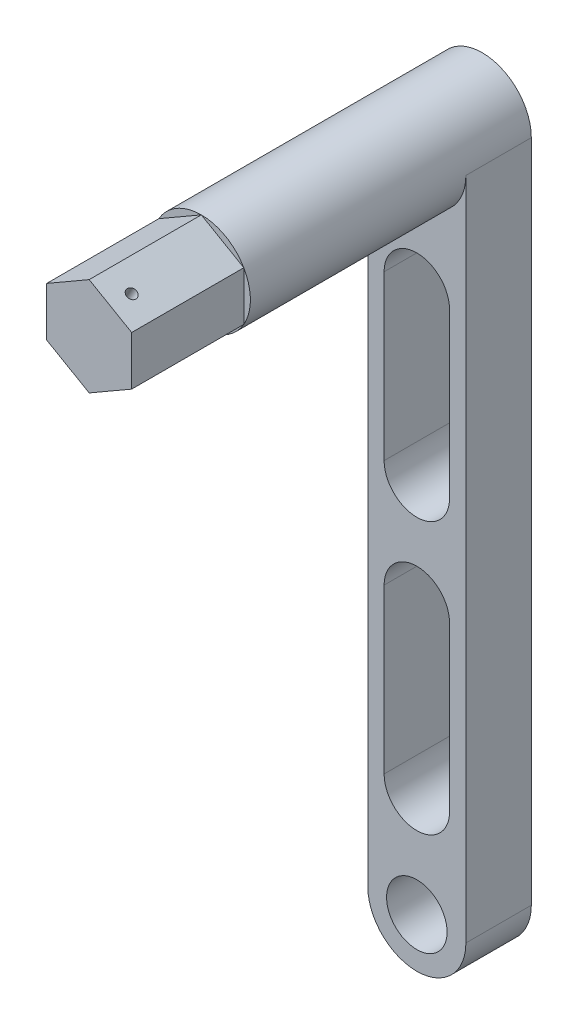
ISO-10303-21;
HEADER;
FILE_DESCRIPTION(('STEP AP214'),'2;1');
FILE_NAME('part.step','',(''),(''),'','','');
FILE_SCHEMA(('AUTOMOTIVE_DESIGN { 1 0 10303 214 1 1 1 1 }'));
ENDSEC;
DATA;
#1=APPLICATION_CONTEXT('core data for automotive mechanical design processes');
#2=APPLICATION_PROTOCOL_DEFINITION('international standard','automotive_design',2000,#1);
#3=PRODUCT_CONTEXT('',#1,'mechanical');
#4=PRODUCT('Part','Part','',(#3));
#5=PRODUCT_RELATED_PRODUCT_CATEGORY('part','',(#4));
#6=PRODUCT_DEFINITION_FORMATION('','',#4);
#7=PRODUCT_DEFINITION_CONTEXT('part definition',#1,'design');
#8=PRODUCT_DEFINITION('design','',#6,#7);
#9=PRODUCT_DEFINITION_SHAPE('','',#8);
#10=(LENGTH_UNIT() NAMED_UNIT(*) SI_UNIT(.MILLI.,.METRE.));
#11=(NAMED_UNIT(*) PLANE_ANGLE_UNIT() SI_UNIT($,.RADIAN.));
#12=(NAMED_UNIT(*) SI_UNIT($,.STERADIAN.) SOLID_ANGLE_UNIT());
#13=UNCERTAINTY_MEASURE_WITH_UNIT(LENGTH_MEASURE(1.E-05),#10,'distance_accuracy_value','');
#14=(GEOMETRIC_REPRESENTATION_CONTEXT(3) GLOBAL_UNCERTAINTY_ASSIGNED_CONTEXT((#13)) GLOBAL_UNIT_ASSIGNED_CONTEXT((#10,
#11,#12)) REPRESENTATION_CONTEXT('',''));
#15=CARTESIAN_POINT('',(0.,0.,0.));
#16=DIRECTION('',(0.,0.,1.));
#17=DIRECTION('',(1.,0.,0.));
#18=AXIS2_PLACEMENT_3D('',#15,#16,#17);
#19=CARTESIAN_POINT('',(0.,0.,42.94));
#20=DIRECTION('',(0.,0.,1.));
#21=DIRECTION('',(1.,0.,0.));
#22=AXIS2_PLACEMENT_3D('',#19,#20,#21);
#23=PLANE('',#22);
#24=DIRECTION('',(0.866025403784441,-0.499999999999995,0.));
#25=VECTOR('',#24,1.);
#26=CARTESIAN_POINT('',(-6.49519052838325,47.0499999999999,42.94));
#27=LINE('',#26,#25);
#28=CARTESIAN_POINT('',(-6.49519052838325,47.0499999999999,42.94));
#29=VERTEX_POINT('',#28);
#30=CARTESIAN_POINT('',(0.,43.3,42.94));
#31=VERTEX_POINT('',#30);
#32=EDGE_CURVE('E64',#29,#31,#27,.T.);
#33=ORIENTED_EDGE('',*,*,#32,.F.);
#34=CARTESIAN_POINT('',(0.,50.8,42.94));
#35=DIRECTION('',(0.,0.,1.));
#36=DIRECTION('',(1.,0.,0.));
#37=AXIS2_PLACEMENT_3D('',#34,#35,#36);
#38=CIRCLE('',#37,7.5);
#39=EDGE_CURVE('E486',#29,#31,#38,.T.);
#40=ORIENTED_EDGE('',*,*,#39,.T.);
#41=EDGE_LOOP('',(#33,#40));
#42=FACE_BOUND('',#41,.T.);
#43=ADVANCED_FACE('F40',(#42),#23,.T.);
#44=DIRECTION('',(0.,-1.,0.));
#45=VECTOR('',#44,1.);
#46=CARTESIAN_POINT('',(-6.49519052838333,54.5499999999999,42.94));
#47=LINE('',#46,#45);
#48=CARTESIAN_POINT('',(-6.49519052838333,54.5499999999999,42.94));
#49=VERTEX_POINT('',#48);
#50=EDGE_CURVE('E189',#49,#29,#47,.T.);
#51=ORIENTED_EDGE('',*,*,#50,.F.);
#52=EDGE_CURVE('E485',#49,#29,#38,.T.);
#53=ORIENTED_EDGE('',*,*,#52,.T.);
#54=EDGE_LOOP('',(#51,#53));
#55=FACE_BOUND('',#54,.T.);
#56=ADVANCED_FACE('F372',(#55),#23,.T.);
#57=DIRECTION('',(-0.866025403784435,-0.500000000000007,0.));
#58=VECTOR('',#57,1.);
#59=CARTESIAN_POINT('',(0.,58.3,42.94));
#60=LINE('',#59,#58);
#61=CARTESIAN_POINT('',(0.,58.3,42.94));
#62=VERTEX_POINT('',#61);
#63=EDGE_CURVE('E440',#62,#49,#60,.T.);
#64=ORIENTED_EDGE('',*,*,#63,.F.);
#65=EDGE_CURVE('E207',#62,#49,#38,.T.);
#66=ORIENTED_EDGE('',*,*,#65,.T.);
#67=EDGE_LOOP('',(#64,#66));
#68=FACE_BOUND('',#67,.T.);
#69=ADVANCED_FACE('F376',(#68),#23,.T.);
#70=DIRECTION('',(-0.866025403784442,0.499999999999995,0.));
#71=VECTOR('',#70,1.);
#72=CARTESIAN_POINT('',(6.49519052838327,54.55,42.94));
#73=LINE('',#72,#71);
#74=CARTESIAN_POINT('',(6.49519052838327,54.55,42.94));
#75=VERTEX_POINT('',#74);
#76=EDGE_CURVE('E436',#75,#62,#73,.T.);
#77=ORIENTED_EDGE('',*,*,#76,.F.);
#78=EDGE_CURVE('E203',#75,#62,#38,.T.);
#79=ORIENTED_EDGE('',*,*,#78,.T.);
#80=EDGE_LOOP('',(#77,#79));
#81=FACE_BOUND('',#80,.T.);
#82=ADVANCED_FACE('F472',(#81),#23,.T.);
#83=DIRECTION('',(0.,1.,0.));
#84=VECTOR('',#83,1.);
#85=CARTESIAN_POINT('',(6.4951905283833,47.05,42.94));
#86=LINE('',#85,#84);
#87=CARTESIAN_POINT('',(6.4951905283833,47.05,42.94));
#88=VERTEX_POINT('',#87);
#89=EDGE_CURVE('E432',#88,#75,#86,.T.);
#90=ORIENTED_EDGE('',*,*,#89,.F.);
#91=EDGE_CURVE('E197',#88,#75,#38,.T.);
#92=ORIENTED_EDGE('',*,*,#91,.T.);
#93=EDGE_LOOP('',(#90,#92));
#94=FACE_BOUND('',#93,.T.);
#95=ADVANCED_FACE('F367',(#94),#23,.T.);
#96=CARTESIAN_POINT('',(0.,-9.675,10.));
#97=DIRECTION('',(0.,0.,-1.));
#98=DIRECTION('',(-1.,0.,0.));
#99=AXIS2_PLACEMENT_3D('',#96,#97,#98);
#100=CYLINDRICAL_SURFACE('',#99,5.);
#101=CARTESIAN_POINT('',(0.,-9.675,0.));
#102=DIRECTION('',(0.,0.,1.));
#103=DIRECTION('',(1.,0.,0.));
#104=AXIS2_PLACEMENT_3D('',#101,#102,#103);
#105=CIRCLE('',#104,5.);
#106=CARTESIAN_POINT('',(5.,-9.67499999999998,0.));
#107=VERTEX_POINT('',#106);
#108=CARTESIAN_POINT('',(-5.00000000000001,-9.67499999999998,0.));
#109=VERTEX_POINT('',#108);
#110=EDGE_CURVE('E285',#107,#109,#105,.T.);
#111=ORIENTED_EDGE('',*,*,#110,.F.);
#112=DIRECTION('',(0.,0.,-1.));
#113=VECTOR('',#112,1.);
#114=CARTESIAN_POINT('',(5.,-9.67499999999998,10.));
#115=LINE('',#114,#113);
#116=CARTESIAN_POINT('',(5.,-9.67499999999998,10.));
#117=VERTEX_POINT('',#116);
#118=EDGE_CURVE('E11',#117,#107,#115,.T.);
#119=ORIENTED_EDGE('',*,*,#118,.F.);
#120=CARTESIAN_POINT('',(0.,-9.675,10.));
#121=DIRECTION('',(0.,0.,1.));
#122=DIRECTION('',(1.,0.,0.));
#123=AXIS2_PLACEMENT_3D('',#120,#121,#122);
#124=CIRCLE('',#123,5.);
#125=CARTESIAN_POINT('',(-5.00000000000001,-9.67499999999998,10.));
#126=VERTEX_POINT('',#125);
#127=EDGE_CURVE('E239',#117,#126,#124,.T.);
#128=ORIENTED_EDGE('',*,*,#127,.T.);
#129=DIRECTION('',(0.,0.,-1.));
#130=VECTOR('',#129,1.);
#131=CARTESIAN_POINT('',(-5.00000000000001,-9.67499999999998,10.));
#132=LINE('',#131,#130);
#133=EDGE_CURVE('E304',#126,#109,#132,.T.);
#134=ORIENTED_EDGE('',*,*,#133,.T.);
#135=EDGE_LOOP('',(#111,#119,#128,#134));
#136=FACE_BOUND('',#135,.T.);
#137=ADVANCED_FACE('F478',(#136),#100,.F.);
#138=CARTESIAN_POINT('',(5.,0.,10.));
#139=DIRECTION('',(-1.,0.,0.));
#140=DIRECTION('',(0.,-1.,0.));
#141=AXIS2_PLACEMENT_3D('',#138,#139,#140);
#142=PLANE('',#141);
#143=DIRECTION('',(0.,1.,0.));
#144=VECTOR('',#143,1.);
#145=CARTESIAN_POINT('',(5.,0.,0.));
#146=LINE('',#145,#144);
#147=CARTESIAN_POINT('',(5.,-34.675,0.));
#148=VERTEX_POINT('',#147);
#149=EDGE_CURVE('E289',#148,#107,#146,.T.);
#150=ORIENTED_EDGE('',*,*,#149,.F.);
#151=DIRECTION('',(0.,0.,-1.));
#152=VECTOR('',#151,1.);
#153=CARTESIAN_POINT('',(5.,-34.675,10.));
#154=LINE('',#153,#152);
#155=CARTESIAN_POINT('',(5.,-34.675,10.));
#156=VERTEX_POINT('',#155);
#157=EDGE_CURVE('E50',#156,#148,#154,.T.);
#158=ORIENTED_EDGE('',*,*,#157,.F.);
#159=DIRECTION('',(0.,1.,0.));
#160=VECTOR('',#159,1.);
#161=CARTESIAN_POINT('',(5.,0.,10.));
#162=LINE('',#161,#160);
#163=EDGE_CURVE('E243',#156,#117,#162,.T.);
#164=ORIENTED_EDGE('',*,*,#163,.T.);
#165=ORIENTED_EDGE('',*,*,#118,.T.);
#166=EDGE_LOOP('',(#150,#158,#164,#165));
#167=FACE_BOUND('',#166,.T.);
#168=ADVANCED_FACE('F607',(#167),#142,.T.);
#169=CARTESIAN_POINT('',(0.,-34.675,10.));
#170=DIRECTION('',(0.,0.,-1.));
#171=DIRECTION('',(-1.,0.,0.));
#172=AXIS2_PLACEMENT_3D('',#169,#170,#171);
#173=CYLINDRICAL_SURFACE('',#172,5.);
#174=CARTESIAN_POINT('',(0.,-34.675,0.));
#175=DIRECTION('',(0.,0.,1.));
#176=DIRECTION('',(1.,0.,0.));
#177=AXIS2_PLACEMENT_3D('',#174,#175,#176);
#178=CIRCLE('',#177,5.);
#179=CARTESIAN_POINT('',(-5.,-34.675,0.));
#180=VERTEX_POINT('',#179);
#181=EDGE_CURVE('E293',#180,#148,#178,.T.);
#182=ORIENTED_EDGE('',*,*,#181,.F.);
#183=DIRECTION('',(0.,0.,-1.));
#184=VECTOR('',#183,1.);
#185=CARTESIAN_POINT('',(-5.,-34.675,10.));
#186=LINE('',#185,#184);
#187=CARTESIAN_POINT('',(-5.,-34.675,10.));
#188=VERTEX_POINT('',#187);
#189=EDGE_CURVE('E307',#188,#180,#186,.T.);
#190=ORIENTED_EDGE('',*,*,#189,.F.);
#191=CARTESIAN_POINT('',(0.,-34.675,10.));
#192=DIRECTION('',(0.,0.,1.));
#193=DIRECTION('',(1.,0.,0.));
#194=AXIS2_PLACEMENT_3D('',#191,#192,#193);
#195=CIRCLE('',#194,5.);
#196=EDGE_CURVE('E247',#188,#156,#195,.T.);
#197=ORIENTED_EDGE('',*,*,#196,.T.);
#198=ORIENTED_EDGE('',*,*,#157,.T.);
#199=EDGE_LOOP('',(#182,#190,#197,#198));
#200=FACE_BOUND('',#199,.T.);
#201=ADVANCED_FACE('F597',(#200),#173,.F.);
#202=CARTESIAN_POINT('',(0.,6.80000000000001,10.));
#203=DIRECTION('',(0.,0.,-1.));
#204=DIRECTION('',(-1.,0.,0.));
#205=AXIS2_PLACEMENT_3D('',#202,#203,#204);
#206=CYLINDRICAL_SURFACE('',#205,5.);
#207=CARTESIAN_POINT('',(0.,6.80000000000001,0.));
#208=DIRECTION('',(0.,0.,1.));
#209=DIRECTION('',(1.,0.,0.));
#210=AXIS2_PLACEMENT_3D('',#207,#208,#209);
#211=CIRCLE('',#210,5.);
#212=CARTESIAN_POINT('',(-5.,6.80000000000001,0.));
#213=VERTEX_POINT('',#212);
#214=CARTESIAN_POINT('',(5.,6.80000000000002,0.));
#215=VERTEX_POINT('',#214);
#216=EDGE_CURVE('E269',#213,#215,#211,.T.);
#217=ORIENTED_EDGE('',*,*,#216,.F.);
#218=DIRECTION('',(0.,0.,-1.));
#219=VECTOR('',#218,1.);
#220=CARTESIAN_POINT('',(-5.,6.80000000000001,10.));
#221=LINE('',#220,#219);
#222=CARTESIAN_POINT('',(-5.,6.80000000000001,10.));
#223=VERTEX_POINT('',#222);
#224=EDGE_CURVE('E308',#223,#213,#221,.T.);
#225=ORIENTED_EDGE('',*,*,#224,.F.);
#226=CARTESIAN_POINT('',(0.,6.80000000000001,10.));
#227=DIRECTION('',(0.,0.,1.));
#228=DIRECTION('',(1.,0.,0.));
#229=AXIS2_PLACEMENT_3D('',#226,#227,#228);
#230=CIRCLE('',#229,5.);
#231=CARTESIAN_POINT('',(5.,6.80000000000002,10.));
#232=VERTEX_POINT('',#231);
#233=EDGE_CURVE('E224',#223,#232,#230,.T.);
#234=ORIENTED_EDGE('',*,*,#233,.T.);
#235=DIRECTION('',(0.,0.,-1.));
#236=VECTOR('',#235,1.);
#237=CARTESIAN_POINT('',(5.,6.80000000000002,10.));
#238=LINE('',#237,#236);
#239=EDGE_CURVE('E313',#232,#215,#238,.T.);
#240=ORIENTED_EDGE('',*,*,#239,.T.);
#241=EDGE_LOOP('',(#217,#225,#234,#240));
#242=FACE_BOUND('',#241,.T.);
#243=ADVANCED_FACE('F587',(#242),#206,.F.);
#244=CARTESIAN_POINT('',(-5.,0.,10.));
#245=DIRECTION('',(1.,0.,0.));
#246=DIRECTION('',(0.,0.,-1.));
#247=AXIS2_PLACEMENT_3D('',#244,#245,#246);
#248=PLANE('',#247);
#249=DIRECTION('',(0.,-1.,0.));
#250=VECTOR('',#249,1.);
#251=CARTESIAN_POINT('',(-5.,0.,0.));
#252=LINE('',#251,#250);
#253=CARTESIAN_POINT('',(-5.,31.8,0.));
#254=VERTEX_POINT('',#253);
#255=EDGE_CURVE('E273',#254,#213,#252,.T.);
#256=ORIENTED_EDGE('',*,*,#255,.F.);
#257=DIRECTION('',(0.,0.,-1.));
#258=VECTOR('',#257,1.);
#259=CARTESIAN_POINT('',(-5.,31.8,10.));
#260=LINE('',#259,#258);
#261=CARTESIAN_POINT('',(-5.,31.8,10.));
#262=VERTEX_POINT('',#261);
#263=EDGE_CURVE('E320',#262,#254,#260,.T.);
#264=ORIENTED_EDGE('',*,*,#263,.F.);
#265=DIRECTION('',(0.,-1.,0.));
#266=VECTOR('',#265,1.);
#267=CARTESIAN_POINT('',(-5.,0.,10.));
#268=LINE('',#267,#266);
#269=EDGE_CURVE('E228',#262,#223,#268,.T.);
#270=ORIENTED_EDGE('',*,*,#269,.T.);
#271=ORIENTED_EDGE('',*,*,#224,.T.);
#272=EDGE_LOOP('',(#256,#264,#270,#271));
#273=FACE_BOUND('',#272,.T.);
#274=ADVANCED_FACE('F577',(#273),#248,.T.);
#275=CARTESIAN_POINT('',(0.,31.8,10.));
#276=DIRECTION('',(0.,0.,-1.));
#277=DIRECTION('',(-1.,0.,0.));
#278=AXIS2_PLACEMENT_3D('',#275,#276,#277);
#279=CYLINDRICAL_SURFACE('',#278,5.);
#280=CARTESIAN_POINT('',(0.,31.8,0.));
#281=DIRECTION('',(0.,0.,1.));
#282=DIRECTION('',(1.,0.,0.));
#283=AXIS2_PLACEMENT_3D('',#280,#281,#282);
#284=CIRCLE('',#283,5.);
#285=CARTESIAN_POINT('',(5.,31.8,0.));
#286=VERTEX_POINT('',#285);
#287=EDGE_CURVE('E277',#286,#254,#284,.T.);
#288=ORIENTED_EDGE('',*,*,#287,.F.);
#289=DIRECTION('',(0.,0.,-1.));
#290=VECTOR('',#289,1.);
#291=CARTESIAN_POINT('',(5.,31.8,10.));
#292=LINE('',#291,#290);
#293=CARTESIAN_POINT('',(5.,31.8,10.));
#294=VERTEX_POINT('',#293);
#295=EDGE_CURVE('E316',#294,#286,#292,.T.);
#296=ORIENTED_EDGE('',*,*,#295,.F.);
#297=CARTESIAN_POINT('',(0.,31.8,10.));
#298=DIRECTION('',(0.,0.,1.));
#299=DIRECTION('',(1.,0.,0.));
#300=AXIS2_PLACEMENT_3D('',#297,#298,#299);
#301=CIRCLE('',#300,5.);
#302=EDGE_CURVE('E232',#294,#262,#301,.T.);
#303=ORIENTED_EDGE('',*,*,#302,.T.);
#304=ORIENTED_EDGE('',*,*,#263,.T.);
#305=EDGE_LOOP('',(#288,#296,#303,#304));
#306=FACE_BOUND('',#305,.T.);
#307=ADVANCED_FACE('F538',(#306),#279,.F.);
#308=CARTESIAN_POINT('',(-7.50000000000001,0.,10.));
#309=DIRECTION('',(-1.,0.,0.));
#310=DIRECTION('',(0.,-1.,0.));
#311=AXIS2_PLACEMENT_3D('',#308,#309,#310);
#312=PLANE('',#311);
#313=DIRECTION('',(0.,1.,0.));
#314=VECTOR('',#313,1.);
#315=CARTESIAN_POINT('',(-7.50000000000001,0.,0.));
#316=LINE('',#315,#314);
#317=CARTESIAN_POINT('',(-7.5,-50.8,0.));
#318=VERTEX_POINT('',#317);
#319=CARTESIAN_POINT('',(-7.5,50.8,0.));
#320=VERTEX_POINT('',#319);
#321=EDGE_CURVE('E206',#318,#320,#316,.T.);
#322=ORIENTED_EDGE('',*,*,#321,.F.);
#323=DIRECTION('',(0.,0.,-1.));
#324=VECTOR('',#323,1.);
#325=CARTESIAN_POINT('',(-7.5,-50.8,10.));
#326=LINE('',#325,#324);
#327=CARTESIAN_POINT('',(-7.5,-50.8,10.));
#328=VERTEX_POINT('',#327);
#329=EDGE_CURVE('E332',#328,#318,#326,.T.);
#330=ORIENTED_EDGE('',*,*,#329,.F.);
#331=DIRECTION('',(0.,1.,0.));
#332=VECTOR('',#331,1.);
#333=CARTESIAN_POINT('',(-7.50000000000001,0.,10.));
#334=LINE('',#333,#332);
#335=CARTESIAN_POINT('',(-7.5,50.8,10.));
#336=VERTEX_POINT('',#335);
#337=EDGE_CURVE('E212',#328,#336,#334,.T.);
#338=ORIENTED_EDGE('',*,*,#337,.T.);
#339=DIRECTION('',(0.,0.,-1.));
#340=VECTOR('',#339,1.);
#341=CARTESIAN_POINT('',(-7.50000000000002,50.8,10.));
#342=LINE('',#341,#340);
#343=EDGE_CURVE('E317',#336,#320,#342,.T.);
#344=ORIENTED_EDGE('',*,*,#343,.T.);
#345=EDGE_LOOP('',(#322,#330,#338,#344));
#346=FACE_BOUND('',#345,.T.);
#347=ADVANCED_FACE('F42',(#346),#312,.T.);
#348=CARTESIAN_POINT('',(0.,-50.8,10.));
#349=DIRECTION('',(0.,0.,-1.));
#350=DIRECTION('',(-1.,0.,0.));
#351=AXIS2_PLACEMENT_3D('',#348,#349,#350);
#352=CYLINDRICAL_SURFACE('',#351,7.5);
#353=CARTESIAN_POINT('',(0.,-50.8,0.));
#354=DIRECTION('',(0.,0.,1.));
#355=DIRECTION('',(1.,0.,0.));
#356=AXIS2_PLACEMENT_3D('',#353,#354,#355);
#357=CIRCLE('',#356,7.5);
#358=CARTESIAN_POINT('',(7.5,-50.8,0.));
#359=VERTEX_POINT('',#358);
#360=EDGE_CURVE('E262',#318,#359,#357,.T.);
#361=ORIENTED_EDGE('',*,*,#360,.T.);
#362=DIRECTION('',(0.,0.,-1.));
#363=VECTOR('',#362,1.);
#364=CARTESIAN_POINT('',(7.5,-50.8,10.));
#365=LINE('',#364,#363);
#366=CARTESIAN_POINT('',(7.5,-50.8,10.));
#367=VERTEX_POINT('',#366);
#368=EDGE_CURVE('E328',#367,#359,#365,.T.);
#369=ORIENTED_EDGE('',*,*,#368,.F.);
#370=CARTESIAN_POINT('',(0.,-50.8,10.));
#371=DIRECTION('',(0.,0.,1.));
#372=DIRECTION('',(1.,0.,0.));
#373=AXIS2_PLACEMENT_3D('',#370,#371,#372);
#374=CIRCLE('',#373,7.5);
#375=EDGE_CURVE('E217',#328,#367,#374,.T.);
#376=ORIENTED_EDGE('',*,*,#375,.F.);
#377=ORIENTED_EDGE('',*,*,#329,.T.);
#378=EDGE_LOOP('',(#361,#369,#376,#377));
#379=FACE_BOUND('',#378,.T.);
#380=ADVANCED_FACE('F348',(#379),#352,.T.);
#381=CARTESIAN_POINT('',(-5.00000000000001,0.,10.));
#382=DIRECTION('',(-1.,0.,0.));
#383=DIRECTION('',(0.,-1.,0.));
#384=AXIS2_PLACEMENT_3D('',#381,#382,#383);
#385=PLANE('',#384);
#386=DIRECTION('',(0.,1.,0.));
#387=VECTOR('',#386,1.);
#388=CARTESIAN_POINT('',(-5.00000000000001,0.,0.));
#389=LINE('',#388,#387);
#390=EDGE_CURVE('E297',#180,#109,#389,.T.);
#391=ORIENTED_EDGE('',*,*,#390,.T.);
#392=ORIENTED_EDGE('',*,*,#133,.F.);
#393=DIRECTION('',(0.,1.,0.));
#394=VECTOR('',#393,1.);
#395=CARTESIAN_POINT('',(-5.00000000000001,0.,10.));
#396=LINE('',#395,#394);
#397=EDGE_CURVE('E251',#188,#126,#396,.T.);
#398=ORIENTED_EDGE('',*,*,#397,.F.);
#399=ORIENTED_EDGE('',*,*,#189,.T.);
#400=EDGE_LOOP('',(#391,#392,#398,#399));
#401=FACE_BOUND('',#400,.T.);
#402=ADVANCED_FACE('F555',(#401),#385,.F.);
#403=CARTESIAN_POINT('',(5.,0.,10.));
#404=DIRECTION('',(1.,0.,0.));
#405=DIRECTION('',(0.,0.,-1.));
#406=AXIS2_PLACEMENT_3D('',#403,#404,#405);
#407=PLANE('',#406);
#408=DIRECTION('',(0.,-1.,0.));
#409=VECTOR('',#408,1.);
#410=CARTESIAN_POINT('',(5.,0.,0.));
#411=LINE('',#410,#409);
#412=EDGE_CURVE('E281',#286,#215,#411,.T.);
#413=ORIENTED_EDGE('',*,*,#412,.T.);
#414=ORIENTED_EDGE('',*,*,#239,.F.);
#415=DIRECTION('',(0.,-1.,0.));
#416=VECTOR('',#415,1.);
#417=CARTESIAN_POINT('',(5.,0.,10.));
#418=LINE('',#417,#416);
#419=EDGE_CURVE('E236',#294,#232,#418,.T.);
#420=ORIENTED_EDGE('',*,*,#419,.F.);
#421=ORIENTED_EDGE('',*,*,#295,.T.);
#422=EDGE_LOOP('',(#413,#414,#420,#421));
#423=FACE_BOUND('',#422,.T.);
#424=ADVANCED_FACE('F527',(#423),#407,.F.);
#425=CARTESIAN_POINT('',(7.49999999999999,0.,10.));
#426=DIRECTION('',(-1.,0.,0.));
#427=DIRECTION('',(0.,-1.,0.));
#428=AXIS2_PLACEMENT_3D('',#425,#426,#427);
#429=PLANE('',#428);
#430=DIRECTION('',(0.,1.,0.));
#431=VECTOR('',#430,1.);
#432=CARTESIAN_POINT('',(7.49999999999999,0.,0.));
#433=LINE('',#432,#431);
#434=CARTESIAN_POINT('',(7.49999999999998,50.8,0.));
#435=VERTEX_POINT('',#434);
#436=EDGE_CURVE('E265',#359,#435,#433,.T.);
#437=ORIENTED_EDGE('',*,*,#436,.T.);
#438=DIRECTION('',(0.,0.,-1.));
#439=VECTOR('',#438,1.);
#440=CARTESIAN_POINT('',(7.49999999999998,50.8,10.));
#441=LINE('',#440,#439);
#442=CARTESIAN_POINT('',(7.5,50.8,10.));
#443=VERTEX_POINT('',#442);
#444=EDGE_CURVE('E258',#443,#435,#441,.T.);
#445=ORIENTED_EDGE('',*,*,#444,.F.);
#446=DIRECTION('',(0.,1.,0.));
#447=VECTOR('',#446,1.);
#448=CARTESIAN_POINT('',(7.49999999999999,0.,10.));
#449=LINE('',#448,#447);
#450=EDGE_CURVE('E220',#367,#443,#449,.T.);
#451=ORIENTED_EDGE('',*,*,#450,.F.);
#452=ORIENTED_EDGE('',*,*,#368,.T.);
#453=EDGE_LOOP('',(#437,#445,#451,#452));
#454=FACE_BOUND('',#453,.T.);
#455=ADVANCED_FACE('F352',(#454),#429,.F.);
#456=CARTESIAN_POINT('',(0.,-50.8,10.));
#457=DIRECTION('',(0.,0.,-1.));
#458=DIRECTION('',(-1.,0.,0.));
#459=AXIS2_PLACEMENT_3D('',#456,#457,#458);
#460=CYLINDRICAL_SURFACE('',#459,4.625);
#461=CARTESIAN_POINT('',(0.,-50.8,10.));
#462=DIRECTION('',(0.,0.,1.));
#463=DIRECTION('',(1.,0.,0.));
#464=AXIS2_PLACEMENT_3D('',#461,#462,#463);
#465=CIRCLE('',#464,4.625);
#466=CARTESIAN_POINT('',(4.62500000000001,-50.8,10.));
#467=VERTEX_POINT('',#466);
#468=EDGE_CURVE('E254',#467,#467,#465,.T.);
#469=ORIENTED_EDGE('',*,*,#468,.T.);
#470=EDGE_LOOP('',(#469));
#471=FACE_BOUND('',#470,.T.);
#472=CARTESIAN_POINT('',(0.,-50.8,0.));
#473=DIRECTION('',(0.,0.,1.));
#474=DIRECTION('',(1.,0.,0.));
#475=AXIS2_PLACEMENT_3D('',#472,#473,#474);
#476=CIRCLE('',#475,4.625);
#477=CARTESIAN_POINT('',(4.62500000000001,-50.8,0.));
#478=VERTEX_POINT('',#477);
#479=EDGE_CURVE('E213',#478,#478,#476,.T.);
#480=ORIENTED_EDGE('',*,*,#479,.F.);
#481=EDGE_LOOP('',(#480));
#482=FACE_BOUND('',#481,.T.);
#483=ADVANCED_FACE('F517',(#471,#482),#460,.F.);
#484=CARTESIAN_POINT('',(0.,0.,10.));
#485=DIRECTION('',(0.,0.,1.));
#486=DIRECTION('',(1.,0.,0.));
#487=AXIS2_PLACEMENT_3D('',#484,#485,#486);
#488=PLANE('',#487);
#489=CARTESIAN_POINT('',(0.,50.8,10.));
#490=DIRECTION('',(0.,0.,1.));
#491=DIRECTION('',(1.,0.,0.));
#492=AXIS2_PLACEMENT_3D('',#489,#490,#491);
#493=CIRCLE('',#492,7.49999999999998);
#494=EDGE_CURVE('E209',#336,#443,#493,.T.);
#495=ORIENTED_EDGE('',*,*,#494,.F.);
#496=ORIENTED_EDGE('',*,*,#337,.F.);
#497=ORIENTED_EDGE('',*,*,#375,.T.);
#498=ORIENTED_EDGE('',*,*,#450,.T.);
#499=EDGE_LOOP('',(#495,#496,#497,#498));
#500=FACE_BOUND('',#499,.T.);
#501=ORIENTED_EDGE('',*,*,#233,.F.);
#502=ORIENTED_EDGE('',*,*,#269,.F.);
#503=ORIENTED_EDGE('',*,*,#302,.F.);
#504=ORIENTED_EDGE('',*,*,#419,.T.);
#505=EDGE_LOOP('',(#501,#502,#503,#504));
#506=FACE_BOUND('',#505,.T.);
#507=ORIENTED_EDGE('',*,*,#127,.F.);
#508=ORIENTED_EDGE('',*,*,#163,.F.);
#509=ORIENTED_EDGE('',*,*,#196,.F.);
#510=ORIENTED_EDGE('',*,*,#397,.T.);
#511=EDGE_LOOP('',(#507,#508,#509,#510));
#512=FACE_BOUND('',#511,.T.);
#513=ORIENTED_EDGE('',*,*,#468,.F.);
#514=EDGE_LOOP('',(#513));
#515=FACE_BOUND('',#514,.T.);
#516=ADVANCED_FACE('F355',(#500,#506,#512,#515),#488,.T.);
#517=CARTESIAN_POINT('',(0.,0.,0.));
#518=DIRECTION('',(0.,0.,1.));
#519=DIRECTION('',(1.,0.,0.));
#520=AXIS2_PLACEMENT_3D('',#517,#518,#519);
#521=PLANE('',#520);
#522=ORIENTED_EDGE('',*,*,#321,.T.);
#523=CARTESIAN_POINT('',(0.,50.8,0.));
#524=DIRECTION('',(0.,0.,1.));
#525=DIRECTION('',(1.,0.,0.));
#526=AXIS2_PLACEMENT_3D('',#523,#524,#525);
#527=CIRCLE('',#526,7.5);
#528=EDGE_CURVE('E193',#435,#320,#527,.T.);
#529=ORIENTED_EDGE('',*,*,#528,.F.);
#530=ORIENTED_EDGE('',*,*,#436,.F.);
#531=ORIENTED_EDGE('',*,*,#360,.F.);
#532=EDGE_LOOP('',(#522,#529,#530,#531));
#533=FACE_BOUND('',#532,.T.);
#534=ORIENTED_EDGE('',*,*,#216,.T.);
#535=ORIENTED_EDGE('',*,*,#412,.F.);
#536=ORIENTED_EDGE('',*,*,#287,.T.);
#537=ORIENTED_EDGE('',*,*,#255,.T.);
#538=EDGE_LOOP('',(#534,#535,#536,#537));
#539=FACE_BOUND('',#538,.T.);
#540=ORIENTED_EDGE('',*,*,#110,.T.);
#541=ORIENTED_EDGE('',*,*,#390,.F.);
#542=ORIENTED_EDGE('',*,*,#181,.T.);
#543=ORIENTED_EDGE('',*,*,#149,.T.);
#544=EDGE_LOOP('',(#540,#541,#542,#543));
#545=FACE_BOUND('',#544,.T.);
#546=ORIENTED_EDGE('',*,*,#479,.T.);
#547=EDGE_LOOP('',(#546));
#548=FACE_BOUND('',#547,.T.);
#549=ADVANCED_FACE('F343',(#533,#539,#545,#548),#521,.F.);
#550=CARTESIAN_POINT('',(0.,50.8,42.94));
#551=DIRECTION('',(0.,0.,-1.));
#552=DIRECTION('',(-1.,0.,0.));
#553=AXIS2_PLACEMENT_3D('',#550,#551,#552);
#554=CYLINDRICAL_SURFACE('',#553,7.5);
#555=ORIENTED_EDGE('',*,*,#78,.F.);
#556=ORIENTED_EDGE('',*,*,#91,.F.);
#557=EDGE_CURVE('E467',#31,#88,#38,.T.);
#558=ORIENTED_EDGE('',*,*,#557,.F.);
#559=ORIENTED_EDGE('',*,*,#39,.F.);
#560=ORIENTED_EDGE('',*,*,#52,.F.);
#561=ORIENTED_EDGE('',*,*,#65,.F.);
#562=EDGE_LOOP('',(#555,#556,#558,#559,#560,#561));
#563=FACE_BOUND('',#562,.T.);
#564=ORIENTED_EDGE('',*,*,#528,.T.);
#565=ORIENTED_EDGE('',*,*,#343,.F.);
#566=ORIENTED_EDGE('',*,*,#494,.T.);
#567=ORIENTED_EDGE('',*,*,#444,.T.);
#568=EDGE_LOOP('',(#564,#565,#566,#567));
#569=FACE_BOUND('',#568,.T.);
#570=ADVANCED_FACE('F357',(#563,#569),#554,.T.);
#571=DIRECTION('',(0.866025403784438,0.500000000000001,0.));
#572=VECTOR('',#571,1.);
#573=CARTESIAN_POINT('',(0.,43.3,42.94));
#574=LINE('',#573,#572);
#575=EDGE_CURVE('E57',#31,#88,#574,.T.);
#576=ORIENTED_EDGE('',*,*,#575,.F.);
#577=ORIENTED_EDGE('',*,*,#557,.T.);
#578=EDGE_LOOP('',(#576,#577));
#579=FACE_BOUND('',#578,.T.);
#580=ADVANCED_FACE('F359',(#579),#23,.T.);
#581=CARTESIAN_POINT('',(-6.49519052838325,47.0499999999999,60.08));
#582=DIRECTION('',(0.499999999999995,0.866025403784441,0.));
#583=DIRECTION('',(-0.866025403784441,0.499999999999995,0.));
#584=AXIS2_PLACEMENT_3D('',#581,#582,#583);
#585=PLANE('',#584);
#586=CARTESIAN_POINT('',(-3.24759526419163,45.1749999999999,56.83));
#587=DIRECTION('',(0.499999999999995,0.866025403784441,0.));
#588=DIRECTION('',(-0.866025403784441,0.499999999999995,0.));
#589=AXIS2_PLACEMENT_3D('',#586,#587,#588);
#590=CIRCLE('',#589,0.750000000000002);
#591=CARTESIAN_POINT('',(-3.89711431702997,45.5499999999999,56.83));
#592=VERTEX_POINT('',#591);
#593=EDGE_CURVE('E412',#592,#592,#590,.T.);
#594=ORIENTED_EDGE('',*,*,#593,.T.);
#595=EDGE_LOOP('',(#594));
#596=FACE_BOUND('',#595,.T.);
#597=ORIENTED_EDGE('',*,*,#32,.T.);
#598=DIRECTION('',(0.,0.,-1.));
#599=VECTOR('',#598,1.);
#600=CARTESIAN_POINT('',(0.,43.3,60.08));
#601=LINE('',#600,#599);
#602=CARTESIAN_POINT('',(0.,43.3,60.08));
#603=VERTEX_POINT('',#602);
#604=EDGE_CURVE('E172',#603,#31,#601,.T.);
#605=ORIENTED_EDGE('',*,*,#604,.F.);
#606=DIRECTION('',(0.866025403784441,-0.499999999999995,0.));
#607=VECTOR('',#606,1.);
#608=CARTESIAN_POINT('',(-6.49519052838325,47.0499999999999,60.08));
#609=LINE('',#608,#607);
#610=CARTESIAN_POINT('',(-6.49519052838325,47.0499999999999,60.08));
#611=VERTEX_POINT('',#610);
#612=EDGE_CURVE('E179',#611,#603,#609,.T.);
#613=ORIENTED_EDGE('',*,*,#612,.F.);
#614=DIRECTION('',(0.,0.,-1.));
#615=VECTOR('',#614,1.);
#616=CARTESIAN_POINT('',(-6.49519052838325,47.0499999999999,60.08));
#617=LINE('',#616,#615);
#618=EDGE_CURVE('E428',#611,#29,#617,.T.);
#619=ORIENTED_EDGE('',*,*,#618,.T.);
#620=EDGE_LOOP('',(#597,#605,#613,#619));
#621=FACE_BOUND('',#620,.T.);
#622=ADVANCED_FACE('F191',(#596,#621),#585,.F.);
#623=CARTESIAN_POINT('',(0.,43.3,60.08));
#624=DIRECTION('',(-0.500000000000001,0.866025403784438,0.));
#625=DIRECTION('',(-0.866025403784438,-0.500000000000001,0.));
#626=AXIS2_PLACEMENT_3D('',#623,#624,#625);
#627=PLANE('',#626);
#628=ORIENTED_EDGE('',*,*,#575,.T.);
#629=DIRECTION('',(0.,0.,-1.));
#630=VECTOR('',#629,1.);
#631=CARTESIAN_POINT('',(6.4951905283833,47.05,60.08));
#632=LINE('',#631,#630);
#633=CARTESIAN_POINT('',(6.4951905283833,47.05,60.08));
#634=VERTEX_POINT('',#633);
#635=EDGE_CURVE('E174',#634,#88,#632,.T.);
#636=ORIENTED_EDGE('',*,*,#635,.F.);
#637=DIRECTION('',(0.866025403784438,0.500000000000001,0.));
#638=VECTOR('',#637,1.);
#639=CARTESIAN_POINT('',(0.,43.3,60.08));
#640=LINE('',#639,#638);
#641=EDGE_CURVE('E168',#603,#634,#640,.T.);
#642=ORIENTED_EDGE('',*,*,#641,.F.);
#643=ORIENTED_EDGE('',*,*,#604,.T.);
#644=EDGE_LOOP('',(#628,#636,#642,#643));
#645=FACE_BOUND('',#644,.T.);
#646=ADVANCED_FACE('F170',(#645),#627,.F.);
#647=CARTESIAN_POINT('',(6.4951905283833,47.05,60.08));
#648=DIRECTION('',(-1.,0.,0.));
#649=DIRECTION('',(0.,-1.,0.));
#650=AXIS2_PLACEMENT_3D('',#647,#648,#649);
#651=PLANE('',#650);
#652=ORIENTED_EDGE('',*,*,#89,.T.);
#653=DIRECTION('',(0.,0.,-1.));
#654=VECTOR('',#653,1.);
#655=CARTESIAN_POINT('',(6.49519052838327,54.55,60.08));
#656=LINE('',#655,#654);
#657=CARTESIAN_POINT('',(6.49519052838327,54.55,60.08));
#658=VERTEX_POINT('',#657);
#659=EDGE_CURVE('E199',#658,#75,#656,.T.);
#660=ORIENTED_EDGE('',*,*,#659,.F.);
#661=DIRECTION('',(0.,1.,0.));
#662=VECTOR('',#661,1.);
#663=CARTESIAN_POINT('',(6.4951905283833,47.05,60.08));
#664=LINE('',#663,#662);
#665=EDGE_CURVE('E178',#634,#658,#664,.T.);
#666=ORIENTED_EDGE('',*,*,#665,.F.);
#667=ORIENTED_EDGE('',*,*,#635,.T.);
#668=EDGE_LOOP('',(#652,#660,#666,#667));
#669=FACE_BOUND('',#668,.T.);
#670=ADVANCED_FACE('F384',(#669),#651,.F.);
#671=CARTESIAN_POINT('',(6.49519052838327,54.55,60.08));
#672=DIRECTION('',(-0.499999999999995,-0.866025403784442,0.));
#673=DIRECTION('',(0.866025403784442,-0.499999999999995,0.));
#674=AXIS2_PLACEMENT_3D('',#671,#672,#673);
#675=PLANE('',#674);
#676=CARTESIAN_POINT('',(3.24759526419161,56.425,56.83));
#677=DIRECTION('',(-0.499999999999995,-0.866025403784442,0.));
#678=DIRECTION('',(0.866025403784442,-0.499999999999995,0.));
#679=AXIS2_PLACEMENT_3D('',#676,#677,#678);
#680=CIRCLE('',#679,0.750000000000002);
#681=CARTESIAN_POINT('',(3.89711431702994,56.05,56.83));
#682=VERTEX_POINT('',#681);
#683=EDGE_CURVE('E44',#682,#682,#680,.T.);
#684=ORIENTED_EDGE('',*,*,#683,.T.);
#685=EDGE_LOOP('',(#684));
#686=FACE_BOUND('',#685,.T.);
#687=ORIENTED_EDGE('',*,*,#76,.T.);
#688=DIRECTION('',(0.,0.,-1.));
#689=VECTOR('',#688,1.);
#690=CARTESIAN_POINT('',(0.,58.3,60.08));
#691=LINE('',#690,#689);
#692=CARTESIAN_POINT('',(0.,58.3,60.08));
#693=VERTEX_POINT('',#692);
#694=EDGE_CURVE('E453',#693,#62,#691,.T.);
#695=ORIENTED_EDGE('',*,*,#694,.F.);
#696=DIRECTION('',(-0.866025403784442,0.499999999999995,0.));
#697=VECTOR('',#696,1.);
#698=CARTESIAN_POINT('',(6.49519052838327,54.55,60.08));
#699=LINE('',#698,#697);
#700=EDGE_CURVE('E421',#658,#693,#699,.T.);
#701=ORIENTED_EDGE('',*,*,#700,.F.);
#702=ORIENTED_EDGE('',*,*,#659,.T.);
#703=EDGE_LOOP('',(#687,#695,#701,#702));
#704=FACE_BOUND('',#703,.T.);
#705=ADVANCED_FACE('F387',(#686,#704),#675,.F.);
#706=CARTESIAN_POINT('',(0.,58.3,60.08));
#707=DIRECTION('',(0.500000000000007,-0.866025403784435,0.));
#708=DIRECTION('',(0.866025403784435,0.500000000000007,0.));
#709=AXIS2_PLACEMENT_3D('',#706,#707,#708);
#710=PLANE('',#709);
#711=ORIENTED_EDGE('',*,*,#63,.T.);
#712=DIRECTION('',(0.,0.,-1.));
#713=VECTOR('',#712,1.);
#714=CARTESIAN_POINT('',(-6.49519052838333,54.5499999999999,60.08));
#715=LINE('',#714,#713);
#716=CARTESIAN_POINT('',(-6.49519052838333,54.5499999999999,60.08));
#717=VERTEX_POINT('',#716);
#718=EDGE_CURVE('E449',#717,#49,#715,.T.);
#719=ORIENTED_EDGE('',*,*,#718,.F.);
#720=DIRECTION('',(-0.866025403784435,-0.500000000000007,0.));
#721=VECTOR('',#720,1.);
#722=CARTESIAN_POINT('',(0.,58.3,60.08));
#723=LINE('',#722,#721);
#724=EDGE_CURVE('E424',#693,#717,#723,.T.);
#725=ORIENTED_EDGE('',*,*,#724,.F.);
#726=ORIENTED_EDGE('',*,*,#694,.T.);
#727=EDGE_LOOP('',(#711,#719,#725,#726));
#728=FACE_BOUND('',#727,.T.);
#729=ADVANCED_FACE('F391',(#728),#710,.F.);
#730=CARTESIAN_POINT('',(-6.49519052838333,54.5499999999999,60.08));
#731=DIRECTION('',(1.,0.,0.));
#732=DIRECTION('',(0.,1.,0.));
#733=AXIS2_PLACEMENT_3D('',#730,#731,#732);
#734=PLANE('',#733);
#735=ORIENTED_EDGE('',*,*,#50,.T.);
#736=ORIENTED_EDGE('',*,*,#618,.F.);
#737=DIRECTION('',(0.,-1.,0.));
#738=VECTOR('',#737,1.);
#739=CARTESIAN_POINT('',(-6.49519052838333,54.5499999999999,60.08));
#740=LINE('',#739,#738);
#741=EDGE_CURVE('E184',#717,#611,#740,.T.);
#742=ORIENTED_EDGE('',*,*,#741,.F.);
#743=ORIENTED_EDGE('',*,*,#718,.T.);
#744=EDGE_LOOP('',(#735,#736,#742,#743));
#745=FACE_BOUND('',#744,.T.);
#746=ADVANCED_FACE('F395',(#745),#734,.F.);
#747=CARTESIAN_POINT('',(0.,0.,60.08));
#748=DIRECTION('',(0.,0.,1.));
#749=DIRECTION('',(1.,0.,0.));
#750=AXIS2_PLACEMENT_3D('',#747,#748,#749);
#751=PLANE('',#750);
#752=ORIENTED_EDGE('',*,*,#612,.T.);
#753=ORIENTED_EDGE('',*,*,#641,.T.);
#754=ORIENTED_EDGE('',*,*,#665,.T.);
#755=ORIENTED_EDGE('',*,*,#700,.T.);
#756=ORIENTED_EDGE('',*,*,#724,.T.);
#757=ORIENTED_EDGE('',*,*,#741,.T.);
#758=EDGE_LOOP('',(#752,#753,#754,#755,#756,#757));
#759=FACE_BOUND('',#758,.T.);
#760=ADVANCED_FACE('F182',(#759),#751,.T.);
#761=CARTESIAN_POINT('',(-49.1166857764408,-34.2725952641922,56.83));
#762=DIRECTION('',(0.499999999999995,0.866025403784442,0.));
#763=DIRECTION('',(-0.866025403784442,0.499999999999995,0.));
#764=AXIS2_PLACEMENT_3D('',#761,#762,#763);
#765=CYLINDRICAL_SURFACE('',#764,0.750000000000002);
#766=ORIENTED_EDGE('',*,*,#683,.F.);
#767=EDGE_LOOP('',(#766));
#768=FACE_BOUND('',#767,.T.);
#769=ORIENTED_EDGE('',*,*,#593,.F.);
#770=EDGE_LOOP('',(#769));
#771=FACE_BOUND('',#770,.T.);
#772=ADVANCED_FACE('F402',(#768,#771),#765,.F.);
#773=CLOSED_SHELL('',(#43,#56,#69,#82,#95,#137,#168,#201,#243,#274,#307,#347,#380,#402,#424,
#455,#483,#516,#549,#570,#580,#622,#646,#670,#705,#729,#746,#760,#772));
#774=MANIFOLD_SOLID_BREP('B2',#773);
#775=ADVANCED_BREP_SHAPE_REPRESENTATION('',(#18,#774),#14);
#776=SHAPE_DEFINITION_REPRESENTATION(#9,#775);
ENDSEC;
END-ISO-10303-21;
